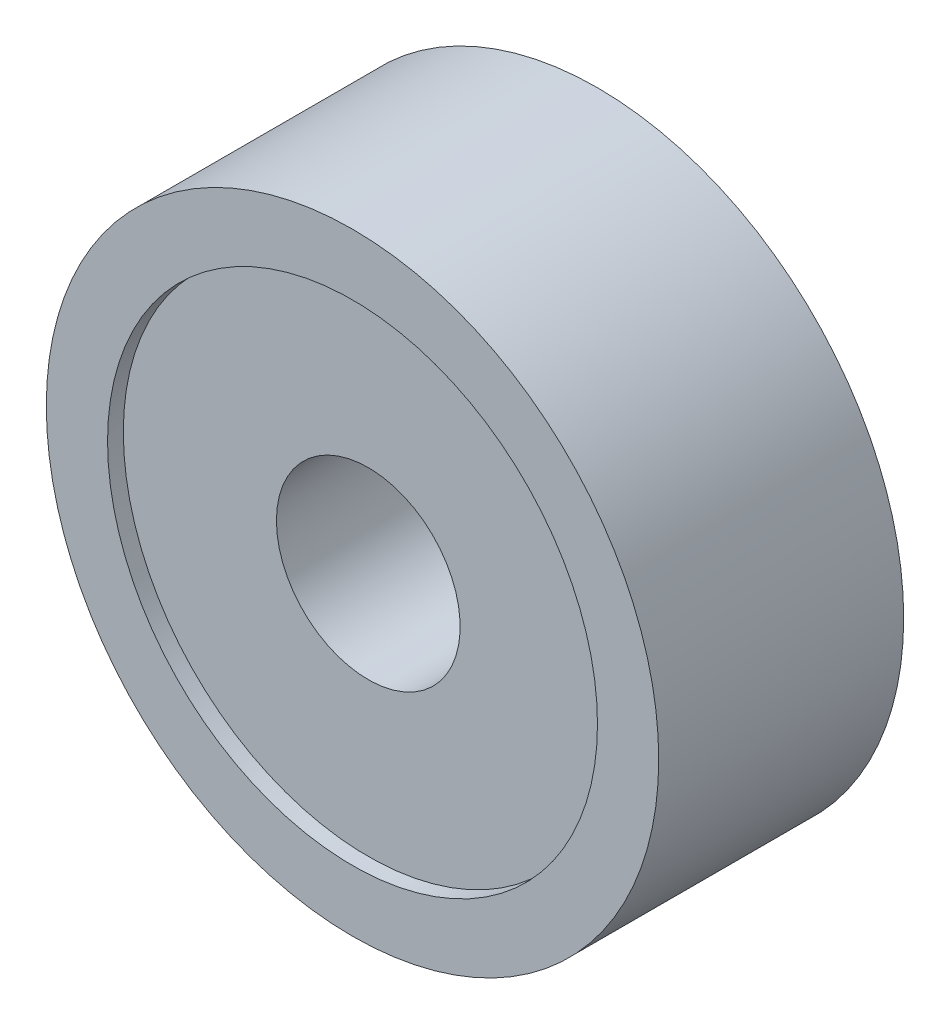
ISO-10303-21;
HEADER;
FILE_DESCRIPTION(('STEP AP214'),'2;1');
FILE_NAME('part.step','',(''),(''),'','','');
FILE_SCHEMA(('AUTOMOTIVE_DESIGN { 1 0 10303 214 1 1 1 1 }'));
ENDSEC;
DATA;
#1=APPLICATION_CONTEXT('core data for automotive mechanical design processes');
#2=APPLICATION_PROTOCOL_DEFINITION('international standard','automotive_design',2000,#1);
#3=PRODUCT_CONTEXT('',#1,'mechanical');
#4=PRODUCT('Part','Part','',(#3));
#5=PRODUCT_RELATED_PRODUCT_CATEGORY('part','',(#4));
#6=PRODUCT_DEFINITION_FORMATION('','',#4);
#7=PRODUCT_DEFINITION_CONTEXT('part definition',#1,'design');
#8=PRODUCT_DEFINITION('design','',#6,#7);
#9=PRODUCT_DEFINITION_SHAPE('','',#8);
#10=(LENGTH_UNIT() NAMED_UNIT(*) SI_UNIT(.MILLI.,.METRE.));
#11=(NAMED_UNIT(*) PLANE_ANGLE_UNIT() SI_UNIT($,.RADIAN.));
#12=(NAMED_UNIT(*) SI_UNIT($,.STERADIAN.) SOLID_ANGLE_UNIT());
#13=UNCERTAINTY_MEASURE_WITH_UNIT(LENGTH_MEASURE(1.E-05),#10,'distance_accuracy_value','');
#14=(GEOMETRIC_REPRESENTATION_CONTEXT(3) GLOBAL_UNCERTAINTY_ASSIGNED_CONTEXT((#13)) GLOBAL_UNIT_ASSIGNED_CONTEXT((#10,
#11,#12)) REPRESENTATION_CONTEXT('',''));
#15=CARTESIAN_POINT('',(0.,0.,0.));
#16=DIRECTION('',(0.,0.,1.));
#17=DIRECTION('',(1.,0.,0.));
#18=AXIS2_PLACEMENT_3D('',#15,#16,#17);
#19=CARTESIAN_POINT('',(0.,0.,4.));
#20=DIRECTION('',(0.,0.,1.));
#21=DIRECTION('',(1.,0.,0.));
#22=AXIS2_PLACEMENT_3D('',#19,#20,#21);
#23=PLANE('',#22);
#24=CARTESIAN_POINT('',(0.,0.,4.));
#25=DIRECTION('',(0.,0.,1.));
#26=DIRECTION('',(1.,0.,0.));
#27=AXIS2_PLACEMENT_3D('',#24,#25,#26);
#28=CIRCLE('',#27,4.);
#29=CARTESIAN_POINT('',(4.,0.,4.));
#30=VERTEX_POINT('',#29);
#31=EDGE_CURVE('E36',#30,#30,#28,.T.);
#32=ORIENTED_EDGE('',*,*,#31,.F.);
#33=EDGE_LOOP('',(#32));
#34=FACE_BOUND('',#33,.T.);
#35=CARTESIAN_POINT('',(0.,0.,4.));
#36=DIRECTION('',(0.,0.,1.));
#37=DIRECTION('',(1.,0.,0.));
#38=AXIS2_PLACEMENT_3D('',#35,#36,#37);
#39=CIRCLE('',#38,5.);
#40=CARTESIAN_POINT('',(5.,0.,4.));
#41=VERTEX_POINT('',#40);
#42=EDGE_CURVE('E10',#41,#41,#39,.T.);
#43=ORIENTED_EDGE('',*,*,#42,.T.);
#44=EDGE_LOOP('',(#43));
#45=FACE_BOUND('',#44,.T.);
#46=ADVANCED_FACE('F32',(#34,#45),#23,.T.);
#47=CARTESIAN_POINT('',(0.,0.,0.));
#48=DIRECTION('',(0.,0.,1.));
#49=DIRECTION('',(1.,0.,0.));
#50=AXIS2_PLACEMENT_3D('',#47,#48,#49);
#51=PLANE('',#50);
#52=CARTESIAN_POINT('',(0.,0.,0.));
#53=DIRECTION('',(0.,0.,1.));
#54=DIRECTION('',(1.,0.,0.));
#55=AXIS2_PLACEMENT_3D('',#52,#53,#54);
#56=CIRCLE('',#55,4.);
#57=CARTESIAN_POINT('',(4.,0.,0.));
#58=VERTEX_POINT('',#57);
#59=EDGE_CURVE('E56',#58,#58,#56,.T.);
#60=ORIENTED_EDGE('',*,*,#59,.T.);
#61=EDGE_LOOP('',(#60));
#62=FACE_BOUND('',#61,.T.);
#63=CARTESIAN_POINT('',(0.,0.,0.));
#64=DIRECTION('',(0.,0.,1.));
#65=DIRECTION('',(1.,0.,0.));
#66=AXIS2_PLACEMENT_3D('',#63,#64,#65);
#67=CIRCLE('',#66,5.);
#68=CARTESIAN_POINT('',(5.,0.,0.));
#69=VERTEX_POINT('',#68);
#70=EDGE_CURVE('E40',#69,#69,#67,.T.);
#71=ORIENTED_EDGE('',*,*,#70,.F.);
#72=EDGE_LOOP('',(#71));
#73=FACE_BOUND('',#72,.T.);
#74=ADVANCED_FACE('F67',(#62,#73),#51,.F.);
#75=CARTESIAN_POINT('',(0.,0.,4.));
#76=DIRECTION('',(0.,0.,-1.));
#77=DIRECTION('',(-1.,0.,0.));
#78=AXIS2_PLACEMENT_3D('',#75,#76,#77);
#79=CYLINDRICAL_SURFACE('',#78,5.);
#80=ORIENTED_EDGE('',*,*,#42,.F.);
#81=EDGE_LOOP('',(#80));
#82=FACE_BOUND('',#81,.T.);
#83=ORIENTED_EDGE('',*,*,#70,.T.);
#84=EDGE_LOOP('',(#83));
#85=FACE_BOUND('',#84,.T.);
#86=ADVANCED_FACE('F34',(#82,#85),#79,.T.);
#87=CARTESIAN_POINT('',(-1.,0.,3.74253749443386));
#88=DIRECTION('',(0.,0.,-1.));
#89=DIRECTION('',(-1.,0.,0.));
#90=AXIS2_PLACEMENT_3D('',#87,#88,#89);
#91=PLANE('',#90);
#92=CARTESIAN_POINT('',(0.,0.,3.74253749443386));
#93=DIRECTION('',(0.,0.,-1.));
#94=DIRECTION('',(-1.,0.,0.));
#95=AXIS2_PLACEMENT_3D('',#92,#93,#94);
#96=CIRCLE('',#95,1.5);
#97=CARTESIAN_POINT('',(-1.5,0.,3.74253749443386));
#98=VERTEX_POINT('',#97);
#99=EDGE_CURVE('E50',#98,#98,#96,.T.);
#100=ORIENTED_EDGE('',*,*,#99,.T.);
#101=EDGE_LOOP('',(#100));
#102=FACE_BOUND('',#101,.T.);
#103=CARTESIAN_POINT('',(0.,0.,3.74253749443386));
#104=DIRECTION('',(0.,0.,-1.));
#105=DIRECTION('',(-1.,0.,0.));
#106=AXIS2_PLACEMENT_3D('',#103,#104,#105);
#107=CIRCLE('',#106,4.);
#108=CARTESIAN_POINT('',(-4.,0.,3.74253749443386));
#109=VERTEX_POINT('',#108);
#110=EDGE_CURVE('E47',#109,#109,#107,.T.);
#111=ORIENTED_EDGE('',*,*,#110,.F.);
#112=EDGE_LOOP('',(#111));
#113=FACE_BOUND('',#112,.T.);
#114=ADVANCED_FACE('F78',(#102,#113),#91,.F.);
#115=CARTESIAN_POINT('',(0.,0.,0.));
#116=DIRECTION('',(0.,0.,-1.));
#117=DIRECTION('',(-1.,0.,0.));
#118=AXIS2_PLACEMENT_3D('',#115,#116,#117);
#119=CYLINDRICAL_SURFACE('',#118,4.);
#120=ORIENTED_EDGE('',*,*,#31,.T.);
#121=EDGE_LOOP('',(#120));
#122=FACE_BOUND('',#121,.T.);
#123=ORIENTED_EDGE('',*,*,#110,.T.);
#124=EDGE_LOOP('',(#123));
#125=FACE_BOUND('',#124,.T.);
#126=ADVANCED_FACE('F63',(#122,#125),#119,.F.);
#127=CARTESIAN_POINT('',(0.,0.,0.));
#128=DIRECTION('',(0.,0.,-1.));
#129=DIRECTION('',(-1.,0.,0.));
#130=AXIS2_PLACEMENT_3D('',#127,#128,#129);
#131=CYLINDRICAL_SURFACE('',#130,4.);
#132=CARTESIAN_POINT('',(0.,0.,0.25));
#133=DIRECTION('',(0.,0.,-1.));
#134=DIRECTION('',(-1.,0.,0.));
#135=AXIS2_PLACEMENT_3D('',#132,#133,#134);
#136=CIRCLE('',#135,4.);
#137=CARTESIAN_POINT('',(-4.,0.,0.25));
#138=VERTEX_POINT('',#137);
#139=EDGE_CURVE('E54',#138,#138,#136,.T.);
#140=ORIENTED_EDGE('',*,*,#139,.F.);
#141=EDGE_LOOP('',(#140));
#142=FACE_BOUND('',#141,.T.);
#143=ORIENTED_EDGE('',*,*,#59,.F.);
#144=EDGE_LOOP('',(#143));
#145=FACE_BOUND('',#144,.T.);
#146=ADVANCED_FACE('F84',(#142,#145),#131,.F.);
#147=CARTESIAN_POINT('',(-1.,0.,0.25));
#148=DIRECTION('',(0.,0.,1.));
#149=DIRECTION('',(1.,0.,0.));
#150=AXIS2_PLACEMENT_3D('',#147,#148,#149);
#151=PLANE('',#150);
#152=CARTESIAN_POINT('',(0.,0.,0.25));
#153=DIRECTION('',(0.,0.,1.));
#154=DIRECTION('',(1.,0.,0.));
#155=AXIS2_PLACEMENT_3D('',#152,#153,#154);
#156=CIRCLE('',#155,1.5);
#157=CARTESIAN_POINT('',(1.5,0.,0.25));
#158=VERTEX_POINT('',#157);
#159=EDGE_CURVE('E53',#158,#158,#156,.T.);
#160=ORIENTED_EDGE('',*,*,#159,.T.);
#161=EDGE_LOOP('',(#160));
#162=FACE_BOUND('',#161,.T.);
#163=ORIENTED_EDGE('',*,*,#139,.T.);
#164=EDGE_LOOP('',(#163));
#165=FACE_BOUND('',#164,.T.);
#166=ADVANCED_FACE('F76',(#162,#165),#151,.F.);
#167=CARTESIAN_POINT('',(0.,0.,4.));
#168=DIRECTION('',(0.,0.,-1.));
#169=DIRECTION('',(-1.,0.,0.));
#170=AXIS2_PLACEMENT_3D('',#167,#168,#169);
#171=CYLINDRICAL_SURFACE('',#170,1.5);
#172=ORIENTED_EDGE('',*,*,#159,.F.);
#173=EDGE_LOOP('',(#172));
#174=FACE_BOUND('',#173,.T.);
#175=ORIENTED_EDGE('',*,*,#99,.F.);
#176=EDGE_LOOP('',(#175));
#177=FACE_BOUND('',#176,.T.);
#178=ADVANCED_FACE('F73',(#174,#177),#171,.F.);
#179=CLOSED_SHELL('',(#46,#74,#86,#114,#126,#146,#166,#178));
#180=MANIFOLD_SOLID_BREP('B2',#179);
#181=ADVANCED_BREP_SHAPE_REPRESENTATION('',(#18,#180),#14);
#182=SHAPE_DEFINITION_REPRESENTATION(#9,#181);
ENDSEC;
END-ISO-10303-21;
